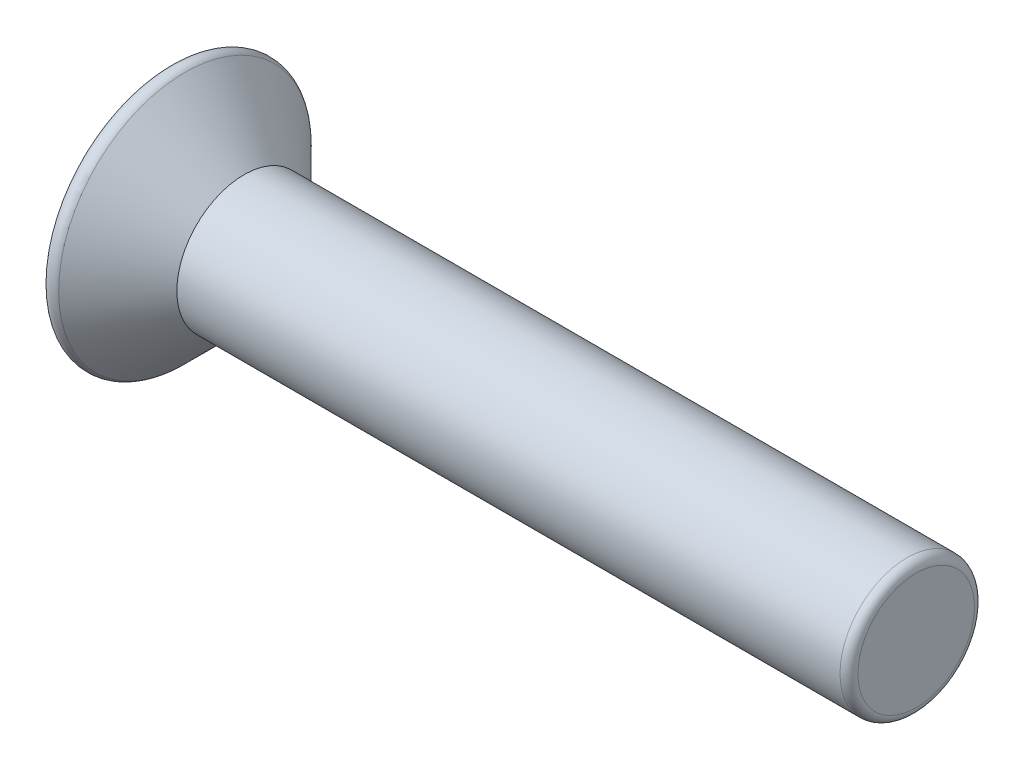
ISO-10303-21;
HEADER;
FILE_DESCRIPTION(('STEP AP214'),'2;1');
FILE_NAME('part.step','',(''),(''),'','','');
FILE_SCHEMA(('AUTOMOTIVE_DESIGN { 1 0 10303 214 1 1 1 1 }'));
ENDSEC;
DATA;
#1=APPLICATION_CONTEXT('core data for automotive mechanical design processes');
#2=APPLICATION_PROTOCOL_DEFINITION('international standard','automotive_design',2000,#1);
#3=PRODUCT_CONTEXT('',#1,'mechanical');
#4=PRODUCT('Part','Part','',(#3));
#5=PRODUCT_RELATED_PRODUCT_CATEGORY('part','',(#4));
#6=PRODUCT_DEFINITION_FORMATION('','',#4);
#7=PRODUCT_DEFINITION_CONTEXT('part definition',#1,'design');
#8=PRODUCT_DEFINITION('design','',#6,#7);
#9=PRODUCT_DEFINITION_SHAPE('','',#8);
#10=(LENGTH_UNIT() NAMED_UNIT(*) SI_UNIT(.MILLI.,.METRE.));
#11=(NAMED_UNIT(*) PLANE_ANGLE_UNIT() SI_UNIT($,.RADIAN.));
#12=(NAMED_UNIT(*) SI_UNIT($,.STERADIAN.) SOLID_ANGLE_UNIT());
#13=UNCERTAINTY_MEASURE_WITH_UNIT(LENGTH_MEASURE(1.E-05),#10,'distance_accuracy_value','');
#14=(GEOMETRIC_REPRESENTATION_CONTEXT(3) GLOBAL_UNCERTAINTY_ASSIGNED_CONTEXT((#13)) GLOBAL_UNIT_ASSIGNED_CONTEXT((#10,
#11,#12)) REPRESENTATION_CONTEXT('',''));
#15=CARTESIAN_POINT('',(0.,0.,0.));
#16=DIRECTION('',(0.,0.,1.));
#17=DIRECTION('',(1.,0.,0.));
#18=AXIS2_PLACEMENT_3D('',#15,#16,#17);
#19=CARTESIAN_POINT('',(0.,0.,0.));
#20=DIRECTION('',(1.,0.,0.));
#21=DIRECTION('',(0.,0.,-1.));
#22=AXIS2_PLACEMENT_3D('',#19,#20,#21);
#23=PLANE('',#22);
#24=CARTESIAN_POINT('',(0.,0.,0.));
#25=DIRECTION('',(1.,0.,0.));
#26=DIRECTION('',(0.,0.,-1.));
#27=AXIS2_PLACEMENT_3D('',#24,#25,#26);
#28=CIRCLE('',#27,2.67715728752538);
#29=CARTESIAN_POINT('',(0.,0.,-2.67715728752538));
#30=VERTEX_POINT('',#29);
#31=EDGE_CURVE('E48',#30,#30,#28,.F.);
#32=ORIENTED_EDGE('',*,*,#31,.T.);
#33=EDGE_LOOP('',(#32));
#34=FACE_BOUND('',#33,.T.);
#35=DIRECTION('',(0.,0.5,0.866025403784439));
#36=VECTOR('',#35,1.);
#37=CARTESIAN_POINT('',(0.,-1.1,0.));
#38=LINE('',#37,#36);
#39=CARTESIAN_POINT('',(0.,-1.1,0.));
#40=VERTEX_POINT('',#39);
#41=CARTESIAN_POINT('',(0.,-0.55,0.952627944162882));
#42=VERTEX_POINT('',#41);
#43=EDGE_CURVE('E135',#40,#42,#38,.T.);
#44=ORIENTED_EDGE('',*,*,#43,.F.);
#45=DIRECTION('',(0.,-0.5,0.866025403784439));
#46=VECTOR('',#45,1.);
#47=CARTESIAN_POINT('',(0.,-0.55,-0.952627944162883));
#48=LINE('',#47,#46);
#49=CARTESIAN_POINT('',(0.,-0.55,-0.952627944162883));
#50=VERTEX_POINT('',#49);
#51=EDGE_CURVE('E55',#50,#40,#48,.T.);
#52=ORIENTED_EDGE('',*,*,#51,.F.);
#53=DIRECTION('',(0.,-1.,0.));
#54=VECTOR('',#53,1.);
#55=CARTESIAN_POINT('',(0.,0.55,-0.952627944162882));
#56=LINE('',#55,#54);
#57=CARTESIAN_POINT('',(0.,0.55,-0.952627944162882));
#58=VERTEX_POINT('',#57);
#59=EDGE_CURVE('E148',#58,#50,#56,.T.);
#60=ORIENTED_EDGE('',*,*,#59,.F.);
#61=DIRECTION('',(0.,-0.5,-0.866025403784439));
#62=VECTOR('',#61,1.);
#63=CARTESIAN_POINT('',(0.,1.1,0.));
#64=LINE('',#63,#62);
#65=CARTESIAN_POINT('',(0.,1.1,0.));
#66=VERTEX_POINT('',#65);
#67=EDGE_CURVE('E145',#66,#58,#64,.T.);
#68=ORIENTED_EDGE('',*,*,#67,.F.);
#69=DIRECTION('',(0.,0.5,-0.866025403784439));
#70=VECTOR('',#69,1.);
#71=CARTESIAN_POINT('',(0.,0.550000000000001,0.952627944162882));
#72=LINE('',#71,#70);
#73=CARTESIAN_POINT('',(0.,0.550000000000001,0.952627944162882));
#74=VERTEX_POINT('',#73);
#75=EDGE_CURVE('E103',#74,#66,#72,.T.);
#76=ORIENTED_EDGE('',*,*,#75,.F.);
#77=DIRECTION('',(0.,1.,0.));
#78=VECTOR('',#77,1.);
#79=CARTESIAN_POINT('',(0.,-0.55,0.952627944162882));
#80=LINE('',#79,#78);
#81=EDGE_CURVE('E139',#42,#74,#80,.T.);
#82=ORIENTED_EDGE('',*,*,#81,.F.);
#83=EDGE_LOOP('',(#44,#52,#60,#68,#76,#82));
#84=FACE_BOUND('',#83,.T.);
#85=ADVANCED_FACE('F39',(#34,#84),#23,.F.);
#86=CARTESIAN_POINT('',(1.66,0.,0.));
#87=DIRECTION('',(-1.,0.,0.));
#88=DIRECTION('',(0.,0.,1.));
#89=AXIS2_PLACEMENT_3D('',#86,#87,#88);
#90=CONICAL_SURFACE('',#89,1.49999999999998,0.785398163397453);
#91=CARTESIAN_POINT('',(0.341421356237311,0.,0.));
#92=DIRECTION('',(1.,0.,0.));
#93=DIRECTION('',(0.,0.,-1.));
#94=AXIS2_PLACEMENT_3D('',#91,#92,#93);
#95=CIRCLE('',#94,2.81857864376269);
#96=CARTESIAN_POINT('',(0.341421356237311,0.,-2.81857864376269));
#97=VERTEX_POINT('',#96);
#98=EDGE_CURVE('E11',#97,#97,#95,.T.);
#99=ORIENTED_EDGE('',*,*,#98,.T.);
#100=EDGE_LOOP('',(#99));
#101=FACE_BOUND('',#100,.T.);
#102=CARTESIAN_POINT('',(1.66,0.,0.));
#103=DIRECTION('',(-1.,0.,0.));
#104=DIRECTION('',(0.,0.,1.));
#105=AXIS2_PLACEMENT_3D('',#102,#103,#104);
#106=CIRCLE('',#105,1.49999999999998);
#107=CARTESIAN_POINT('',(1.66,0.,1.49999999999998));
#108=VERTEX_POINT('',#107);
#109=EDGE_CURVE('E154',#108,#108,#106,.T.);
#110=ORIENTED_EDGE('',*,*,#109,.T.);
#111=EDGE_LOOP('',(#110));
#112=FACE_BOUND('',#111,.T.);
#113=ADVANCED_FACE('F189',(#101,#112),#90,.T.);
#114=CARTESIAN_POINT('',(-5.76894587386338,0.,0.));
#115=DIRECTION('',(-1.,0.,0.));
#116=DIRECTION('',(0.,0.,1.));
#117=AXIS2_PLACEMENT_3D('',#114,#115,#116);
#118=CYLINDRICAL_SURFACE('',#117,1.49999999999998);
#119=CARTESIAN_POINT('',(16.46,0.,0.));
#120=DIRECTION('',(-1.,0.,0.));
#121=DIRECTION('',(0.,0.,1.));
#122=AXIS2_PLACEMENT_3D('',#119,#120,#121);
#123=CIRCLE('',#122,1.49999999999998);
#124=CARTESIAN_POINT('',(16.46,0.,1.49999999999998));
#125=VERTEX_POINT('',#124);
#126=EDGE_CURVE('E167',#125,#125,#123,.T.);
#127=ORIENTED_EDGE('',*,*,#126,.T.);
#128=EDGE_LOOP('',(#127));
#129=FACE_BOUND('',#128,.T.);
#130=ORIENTED_EDGE('',*,*,#109,.F.);
#131=EDGE_LOOP('',(#130));
#132=FACE_BOUND('',#131,.T.);
#133=ADVANCED_FACE('F194',(#129,#132),#118,.T.);
#134=CARTESIAN_POINT('',(16.66,1.49999999999998,0.));
#135=DIRECTION('',(-1.,0.,0.));
#136=DIRECTION('',(0.,0.,1.));
#137=AXIS2_PLACEMENT_3D('',#134,#135,#136);
#138=PLANE('',#137);
#139=CARTESIAN_POINT('',(16.66,0.,0.));
#140=DIRECTION('',(-1.,0.,0.));
#141=DIRECTION('',(0.,0.,1.));
#142=AXIS2_PLACEMENT_3D('',#139,#140,#141);
#143=CIRCLE('',#142,1.29999999999998);
#144=CARTESIAN_POINT('',(16.66,0.,1.29999999999998));
#145=VERTEX_POINT('',#144);
#146=EDGE_CURVE('E171',#145,#145,#143,.F.);
#147=ORIENTED_EDGE('',*,*,#146,.T.);
#148=EDGE_LOOP('',(#147));
#149=FACE_BOUND('',#148,.T.);
#150=ADVANCED_FACE('F200',(#149),#138,.F.);
#151=CARTESIAN_POINT('',(0.1,-0.55,-0.952627944162883));
#152=DIRECTION('',(0.,-0.866025403784439,-0.5));
#153=DIRECTION('',(0.,0.5,-0.866025403784439));
#154=AXIS2_PLACEMENT_3D('',#151,#152,#153);
#155=PLANE('',#154);
#156=ORIENTED_EDGE('',*,*,#51,.T.);
#157=DIRECTION('',(-1.,0.,0.));
#158=VECTOR('',#157,1.);
#159=CARTESIAN_POINT('',(0.1,-1.1,0.));
#160=LINE('',#159,#158);
#161=CARTESIAN_POINT('',(0.1,-1.1,0.));
#162=VERTEX_POINT('',#161);
#163=EDGE_CURVE('E85',#162,#40,#160,.T.);
#164=ORIENTED_EDGE('',*,*,#163,.F.);
#165=DIRECTION('',(0.,-0.5,0.866025403784439));
#166=VECTOR('',#165,1.);
#167=CARTESIAN_POINT('',(0.1,-0.55,-0.952627944162883));
#168=LINE('',#167,#166);
#169=CARTESIAN_POINT('',(0.1,-0.55,-0.952627944162883));
#170=VERTEX_POINT('',#169);
#171=EDGE_CURVE('E151',#170,#162,#168,.T.);
#172=ORIENTED_EDGE('',*,*,#171,.F.);
#173=DIRECTION('',(-1.,0.,0.));
#174=VECTOR('',#173,1.);
#175=CARTESIAN_POINT('',(0.1,-0.55,-0.952627944162883));
#176=LINE('',#175,#174);
#177=EDGE_CURVE('E63',#170,#50,#176,.T.);
#178=ORIENTED_EDGE('',*,*,#177,.T.);
#179=EDGE_LOOP('',(#156,#164,#172,#178));
#180=FACE_BOUND('',#179,.T.);
#181=ADVANCED_FACE('F204',(#180),#155,.F.);
#182=CARTESIAN_POINT('',(0.1,0.55,-0.952627944162882));
#183=DIRECTION('',(0.,0.,-1.));
#184=DIRECTION('',(0.,1.,0.));
#185=AXIS2_PLACEMENT_3D('',#182,#183,#184);
#186=PLANE('',#185);
#187=ORIENTED_EDGE('',*,*,#59,.T.);
#188=ORIENTED_EDGE('',*,*,#177,.F.);
#189=DIRECTION('',(0.,-1.,0.));
#190=VECTOR('',#189,1.);
#191=CARTESIAN_POINT('',(0.1,0.55,-0.952627944162882));
#192=LINE('',#191,#190);
#193=CARTESIAN_POINT('',(0.1,0.55,-0.952627944162882));
#194=VERTEX_POINT('',#193);
#195=EDGE_CURVE('E117',#194,#170,#192,.T.);
#196=ORIENTED_EDGE('',*,*,#195,.F.);
#197=DIRECTION('',(-1.,0.,0.));
#198=VECTOR('',#197,1.);
#199=CARTESIAN_POINT('',(0.1,0.55,-0.952627944162882));
#200=LINE('',#199,#198);
#201=EDGE_CURVE('E108',#194,#58,#200,.T.);
#202=ORIENTED_EDGE('',*,*,#201,.T.);
#203=EDGE_LOOP('',(#187,#188,#196,#202));
#204=FACE_BOUND('',#203,.T.);
#205=ADVANCED_FACE('F208',(#204),#186,.F.);
#206=CARTESIAN_POINT('',(0.1,1.1,0.));
#207=DIRECTION('',(0.,0.866025403784439,-0.5));
#208=DIRECTION('',(0.,0.5,0.866025403784439));
#209=AXIS2_PLACEMENT_3D('',#206,#207,#208);
#210=PLANE('',#209);
#211=ORIENTED_EDGE('',*,*,#67,.T.);
#212=ORIENTED_EDGE('',*,*,#201,.F.);
#213=DIRECTION('',(0.,-0.5,-0.866025403784439));
#214=VECTOR('',#213,1.);
#215=CARTESIAN_POINT('',(0.1,1.1,0.));
#216=LINE('',#215,#214);
#217=CARTESIAN_POINT('',(0.1,1.1,0.));
#218=VERTEX_POINT('',#217);
#219=EDGE_CURVE('E112',#218,#194,#216,.T.);
#220=ORIENTED_EDGE('',*,*,#219,.F.);
#221=DIRECTION('',(-1.,0.,0.));
#222=VECTOR('',#221,1.);
#223=CARTESIAN_POINT('',(0.1,1.1,0.));
#224=LINE('',#223,#222);
#225=EDGE_CURVE('E96',#218,#66,#224,.T.);
#226=ORIENTED_EDGE('',*,*,#225,.T.);
#227=EDGE_LOOP('',(#211,#212,#220,#226));
#228=FACE_BOUND('',#227,.T.);
#229=ADVANCED_FACE('F113',(#228),#210,.F.);
#230=CARTESIAN_POINT('',(0.1,0.550000000000001,0.952627944162882));
#231=DIRECTION('',(0.,0.866025403784439,0.5));
#232=DIRECTION('',(0.,-0.5,0.866025403784439));
#233=AXIS2_PLACEMENT_3D('',#230,#231,#232);
#234=PLANE('',#233);
#235=ORIENTED_EDGE('',*,*,#75,.T.);
#236=ORIENTED_EDGE('',*,*,#225,.F.);
#237=DIRECTION('',(0.,0.5,-0.866025403784439));
#238=VECTOR('',#237,1.);
#239=CARTESIAN_POINT('',(0.1,0.550000000000001,0.952627944162882));
#240=LINE('',#239,#238);
#241=CARTESIAN_POINT('',(0.1,0.550000000000001,0.952627944162882));
#242=VERTEX_POINT('',#241);
#243=EDGE_CURVE('E100',#242,#218,#240,.T.);
#244=ORIENTED_EDGE('',*,*,#243,.F.);
#245=DIRECTION('',(-1.,0.,0.));
#246=VECTOR('',#245,1.);
#247=CARTESIAN_POINT('',(0.1,0.550000000000001,0.952627944162882));
#248=LINE('',#247,#246);
#249=EDGE_CURVE('E109',#242,#74,#248,.T.);
#250=ORIENTED_EDGE('',*,*,#249,.T.);
#251=EDGE_LOOP('',(#235,#236,#244,#250));
#252=FACE_BOUND('',#251,.T.);
#253=ADVANCED_FACE('F98',(#252),#234,.F.);
#254=CARTESIAN_POINT('',(0.1,-0.55,0.952627944162882));
#255=DIRECTION('',(0.,0.,1.));
#256=DIRECTION('',(1.,0.,0.));
#257=AXIS2_PLACEMENT_3D('',#254,#255,#256);
#258=PLANE('',#257);
#259=ORIENTED_EDGE('',*,*,#81,.T.);
#260=ORIENTED_EDGE('',*,*,#249,.F.);
#261=DIRECTION('',(0.,1.,0.));
#262=VECTOR('',#261,1.);
#263=CARTESIAN_POINT('',(0.1,-0.55,0.952627944162882));
#264=LINE('',#263,#262);
#265=CARTESIAN_POINT('',(0.1,-0.55,0.952627944162882));
#266=VERTEX_POINT('',#265);
#267=EDGE_CURVE('E123',#266,#242,#264,.T.);
#268=ORIENTED_EDGE('',*,*,#267,.F.);
#269=DIRECTION('',(-1.,0.,0.));
#270=VECTOR('',#269,1.);
#271=CARTESIAN_POINT('',(0.1,-0.55,0.952627944162882));
#272=LINE('',#271,#270);
#273=EDGE_CURVE('E159',#266,#42,#272,.T.);
#274=ORIENTED_EDGE('',*,*,#273,.T.);
#275=EDGE_LOOP('',(#259,#260,#268,#274));
#276=FACE_BOUND('',#275,.T.);
#277=ADVANCED_FACE('F212',(#276),#258,.F.);
#278=CARTESIAN_POINT('',(0.1,-1.1,0.));
#279=DIRECTION('',(0.,-0.866025403784439,0.5));
#280=DIRECTION('',(0.,-0.5,-0.866025403784439));
#281=AXIS2_PLACEMENT_3D('',#278,#279,#280);
#282=PLANE('',#281);
#283=ORIENTED_EDGE('',*,*,#43,.T.);
#284=ORIENTED_EDGE('',*,*,#273,.F.);
#285=DIRECTION('',(0.,0.5,0.866025403784439));
#286=VECTOR('',#285,1.);
#287=CARTESIAN_POINT('',(0.1,-1.1,0.));
#288=LINE('',#287,#286);
#289=EDGE_CURVE('E127',#162,#266,#288,.T.);
#290=ORIENTED_EDGE('',*,*,#289,.F.);
#291=ORIENTED_EDGE('',*,*,#163,.T.);
#292=EDGE_LOOP('',(#283,#284,#290,#291));
#293=FACE_BOUND('',#292,.T.);
#294=ADVANCED_FACE('F209',(#293),#282,.F.);
#295=CARTESIAN_POINT('',(0.1,0.,0.));
#296=DIRECTION('',(-1.,0.,0.));
#297=DIRECTION('',(0.,0.,1.));
#298=AXIS2_PLACEMENT_3D('',#295,#296,#297);
#299=PLANE('',#298);
#300=ORIENTED_EDGE('',*,*,#171,.T.);
#301=ORIENTED_EDGE('',*,*,#289,.T.);
#302=ORIENTED_EDGE('',*,*,#267,.T.);
#303=ORIENTED_EDGE('',*,*,#243,.T.);
#304=ORIENTED_EDGE('',*,*,#219,.T.);
#305=ORIENTED_EDGE('',*,*,#195,.T.);
#306=EDGE_LOOP('',(#300,#301,#302,#303,#304,#305));
#307=FACE_BOUND('',#306,.T.);
#308=ADVANCED_FACE('F120',(#307),#299,.T.);
#309=CARTESIAN_POINT('',(16.46,0.,0.));
#310=DIRECTION('',(-1.,0.,0.));
#311=DIRECTION('',(0.,0.,1.));
#312=AXIS2_PLACEMENT_3D('',#309,#310,#311);
#313=TOROIDAL_SURFACE('',#312,1.29999999999998,0.2);
#314=ORIENTED_EDGE('',*,*,#146,.F.);
#315=EDGE_LOOP('',(#314));
#316=FACE_BOUND('',#315,.T.);
#317=ORIENTED_EDGE('',*,*,#126,.F.);
#318=EDGE_LOOP('',(#317));
#319=FACE_BOUND('',#318,.T.);
#320=ADVANCED_FACE('F181',(#316,#319),#313,.T.);
#321=CARTESIAN_POINT('',(0.2,0.,0.));
#322=DIRECTION('',(1.,0.,0.));
#323=DIRECTION('',(0.,0.,-1.));
#324=AXIS2_PLACEMENT_3D('',#321,#322,#323);
#325=TOROIDAL_SURFACE('',#324,2.67715728752538,0.2);
#326=ORIENTED_EDGE('',*,*,#98,.F.);
#327=EDGE_LOOP('',(#326));
#328=FACE_BOUND('',#327,.T.);
#329=ORIENTED_EDGE('',*,*,#31,.F.);
#330=EDGE_LOOP('',(#329));
#331=FACE_BOUND('',#330,.T.);
#332=ADVANCED_FACE('F41',(#328,#331),#325,.T.);
#333=CLOSED_SHELL('',(#85,#113,#133,#150,#181,#205,#229,#253,#277,#294,#308,#320,#332));
#334=MANIFOLD_SOLID_BREP('B2',#333);
#335=ADVANCED_BREP_SHAPE_REPRESENTATION('',(#18,#334),#14);
#336=SHAPE_DEFINITION_REPRESENTATION(#9,#335);
ENDSEC;
END-ISO-10303-21;
